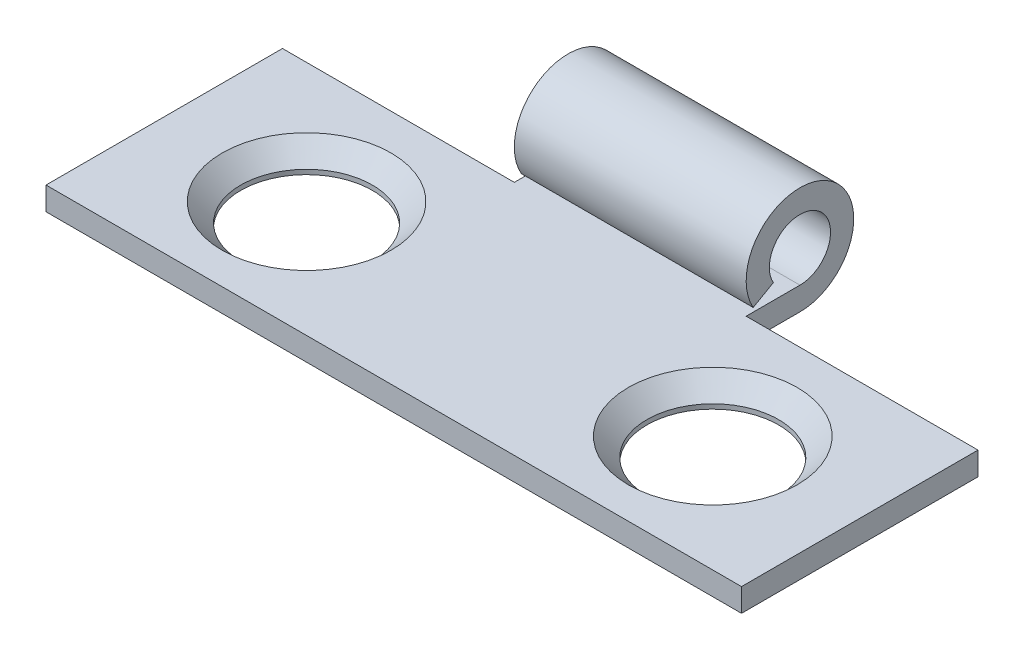
ISO-10303-21;
HEADER;
FILE_DESCRIPTION(('STEP AP214'),'2;1');
FILE_NAME('part.step','',(''),(''),'','','');
FILE_SCHEMA(('AUTOMOTIVE_DESIGN { 1 0 10303 214 1 1 1 1 }'));
ENDSEC;
DATA;
#1=APPLICATION_CONTEXT('core data for automotive mechanical design processes');
#2=APPLICATION_PROTOCOL_DEFINITION('international standard','automotive_design',2000,#1);
#3=PRODUCT_CONTEXT('',#1,'mechanical');
#4=PRODUCT('Part','Part','',(#3));
#5=PRODUCT_RELATED_PRODUCT_CATEGORY('part','',(#4));
#6=PRODUCT_DEFINITION_FORMATION('','',#4);
#7=PRODUCT_DEFINITION_CONTEXT('part definition',#1,'design');
#8=PRODUCT_DEFINITION('design','',#6,#7);
#9=PRODUCT_DEFINITION_SHAPE('','',#8);
#10=(LENGTH_UNIT() NAMED_UNIT(*) SI_UNIT(.MILLI.,.METRE.));
#11=(NAMED_UNIT(*) PLANE_ANGLE_UNIT() SI_UNIT($,.RADIAN.));
#12=(NAMED_UNIT(*) SI_UNIT($,.STERADIAN.) SOLID_ANGLE_UNIT());
#13=UNCERTAINTY_MEASURE_WITH_UNIT(LENGTH_MEASURE(1.E-05),#10,'distance_accuracy_value','');
#14=(GEOMETRIC_REPRESENTATION_CONTEXT(3) GLOBAL_UNCERTAINTY_ASSIGNED_CONTEXT((#13)) GLOBAL_UNIT_ASSIGNED_CONTEXT((#10,
#11,#12)) REPRESENTATION_CONTEXT('',''));
#15=CARTESIAN_POINT('',(0.,0.,0.));
#16=DIRECTION('',(0.,0.,1.));
#17=DIRECTION('',(1.,0.,0.));
#18=AXIS2_PLACEMENT_3D('',#15,#16,#17);
#19=CARTESIAN_POINT('',(9.525,0.,0.));
#20=DIRECTION('',(-1.,0.,0.));
#21=DIRECTION('',(0.,0.,1.));
#22=AXIS2_PLACEMENT_3D('',#19,#20,#21);
#23=CYLINDRICAL_SURFACE('',#22,1.47320000000008);
#24=CARTESIAN_POINT('',(-3.175,0.,0.));
#25=DIRECTION('',(1.,0.,0.));
#26=DIRECTION('',(0.,0.,-1.));
#27=AXIS2_PLACEMENT_3D('',#24,#25,#26);
#28=CIRCLE('',#27,1.47320000000008);
#29=CARTESIAN_POINT('',(-3.175,-1.4732,0.));
#30=VERTEX_POINT('',#29);
#31=CARTESIAN_POINT('',(-3.175,-0.728533124002553,1.28045215733782));
#32=VERTEX_POINT('',#31);
#33=EDGE_CURVE('E134',#30,#32,#28,.T.);
#34=ORIENTED_EDGE('',*,*,#33,.T.);
#35=DIRECTION('',(-1.,0.,0.));
#36=VECTOR('',#35,1.);
#37=CARTESIAN_POINT('',(9.525,-0.728533124002553,1.28045215733782));
#38=LINE('',#37,#36);
#39=CARTESIAN_POINT('',(3.175,-0.728533124002552,1.28045215733782));
#40=VERTEX_POINT('',#39);
#41=EDGE_CURVE('E192',#40,#32,#38,.T.);
#42=ORIENTED_EDGE('',*,*,#41,.F.);
#43=CARTESIAN_POINT('',(3.175,0.,0.));
#44=DIRECTION('',(-1.,0.,0.));
#45=DIRECTION('',(0.,0.,1.));
#46=AXIS2_PLACEMENT_3D('',#43,#44,#45);
#47=CIRCLE('',#46,1.47320000000008);
#48=CARTESIAN_POINT('',(3.175,-1.4732,0.));
#49=VERTEX_POINT('',#48);
#50=EDGE_CURVE('E164',#40,#49,#47,.T.);
#51=ORIENTED_EDGE('',*,*,#50,.T.);
#52=DIRECTION('',(-1.,0.,0.));
#53=VECTOR('',#52,1.);
#54=CARTESIAN_POINT('',(9.525,-1.4732,0.));
#55=LINE('',#54,#53);
#56=EDGE_CURVE('E195',#49,#30,#55,.T.);
#57=ORIENTED_EDGE('',*,*,#56,.T.);
#58=EDGE_LOOP('',(#34,#42,#51,#57));
#59=FACE_BOUND('',#58,.T.);
#60=ADVANCED_FACE('F43',(#59),#23,.T.);
#61=CARTESIAN_POINT('',(9.525,0.,0.));
#62=DIRECTION('',(-1.,0.,0.));
#63=DIRECTION('',(0.,0.,1.));
#64=AXIS2_PLACEMENT_3D('',#61,#62,#63);
#65=CYLINDRICAL_SURFACE('',#64,0.8382);
#66=DIRECTION('',(-1.,0.,0.));
#67=VECTOR('',#66,1.);
#68=CARTESIAN_POINT('',(9.525,-0.414510225725591,0.728533124002553));
#69=LINE('',#68,#67);
#70=CARTESIAN_POINT('',(3.175,-0.414510225725591,0.728533124002553));
#71=VERTEX_POINT('',#70);
#72=CARTESIAN_POINT('',(-3.175,-0.414510225725591,0.728533124002553));
#73=VERTEX_POINT('',#72);
#74=EDGE_CURVE('E185',#71,#73,#69,.T.);
#75=ORIENTED_EDGE('',*,*,#74,.T.);
#76=CARTESIAN_POINT('',(-3.175,0.,0.));
#77=DIRECTION('',(1.,0.,0.));
#78=DIRECTION('',(0.,0.,-1.));
#79=AXIS2_PLACEMENT_3D('',#76,#77,#78);
#80=CIRCLE('',#79,0.8382);
#81=CARTESIAN_POINT('',(-3.175,-0.8382,0.));
#82=VERTEX_POINT('',#81);
#83=EDGE_CURVE('E171',#73,#82,#80,.F.);
#84=ORIENTED_EDGE('',*,*,#83,.T.);
#85=DIRECTION('',(-1.,0.,0.));
#86=VECTOR('',#85,1.);
#87=CARTESIAN_POINT('',(9.525,-0.8382,0.));
#88=LINE('',#87,#86);
#89=CARTESIAN_POINT('',(3.175,-0.8382,0.));
#90=VERTEX_POINT('',#89);
#91=EDGE_CURVE('E202',#90,#82,#88,.T.);
#92=ORIENTED_EDGE('',*,*,#91,.F.);
#93=CARTESIAN_POINT('',(3.175,0.,0.));
#94=DIRECTION('',(-1.,0.,0.));
#95=DIRECTION('',(0.,0.,1.));
#96=AXIS2_PLACEMENT_3D('',#93,#94,#95);
#97=CIRCLE('',#96,0.8382);
#98=EDGE_CURVE('E163',#90,#71,#97,.F.);
#99=ORIENTED_EDGE('',*,*,#98,.T.);
#100=EDGE_LOOP('',(#75,#84,#92,#99));
#101=FACE_BOUND('',#100,.T.);
#102=ADVANCED_FACE('F45',(#101),#65,.F.);
#103=CARTESIAN_POINT('',(9.525,-0.8382,7.9502));
#104=DIRECTION('',(0.,-1.,0.));
#105=DIRECTION('',(0.,0.,-1.));
#106=AXIS2_PLACEMENT_3D('',#103,#104,#105);
#107=PLANE('',#106);
#108=CARTESIAN_POINT('',(5.5626,-0.8382,4.7752));
#109=DIRECTION('',(0.,1.,0.));
#110=DIRECTION('',(0.,0.,1.));
#111=AXIS2_PLACEMENT_3D('',#108,#109,#110);
#112=CIRCLE('',#111,2.3114);
#113=CARTESIAN_POINT('',(5.5626,-0.8382,7.0866));
#114=VERTEX_POINT('',#113);
#115=EDGE_CURVE('E157',#114,#114,#112,.T.);
#116=ORIENTED_EDGE('',*,*,#115,.F.);
#117=EDGE_LOOP('',(#116));
#118=FACE_BOUND('',#117,.T.);
#119=CARTESIAN_POINT('',(-5.5626,-0.8382,4.7752));
#120=DIRECTION('',(0.,1.,0.));
#121=DIRECTION('',(0.,0.,1.));
#122=AXIS2_PLACEMENT_3D('',#119,#120,#121);
#123=CIRCLE('',#122,2.3114);
#124=CARTESIAN_POINT('',(-5.5626,-0.8382,7.0866));
#125=VERTEX_POINT('',#124);
#126=EDGE_CURVE('E149',#125,#125,#123,.T.);
#127=ORIENTED_EDGE('',*,*,#126,.F.);
#128=EDGE_LOOP('',(#127));
#129=FACE_BOUND('',#128,.T.);
#130=ORIENTED_EDGE('',*,*,#91,.T.);
#131=DIRECTION('',(0.,0.,1.));
#132=VECTOR('',#131,1.);
#133=CARTESIAN_POINT('',(-3.175,-0.8382,7.9502));
#134=LINE('',#133,#132);
#135=CARTESIAN_POINT('',(-3.175,-0.8382,1.47320000000012));
#136=VERTEX_POINT('',#135);
#137=EDGE_CURVE('E173',#82,#136,#134,.T.);
#138=ORIENTED_EDGE('',*,*,#137,.T.);
#139=DIRECTION('',(-1.,0.,0.));
#140=VECTOR('',#139,1.);
#141=CARTESIAN_POINT('',(9.5250000000001,-0.8382,1.47320000000031));
#142=LINE('',#141,#140);
#143=CARTESIAN_POINT('',(-9.52499999999999,-0.8382,1.47320000000003));
#144=VERTEX_POINT('',#143);
#145=EDGE_CURVE('E125',#136,#144,#142,.T.);
#146=ORIENTED_EDGE('',*,*,#145,.T.);
#147=DIRECTION('',(0.,0.,1.));
#148=VECTOR('',#147,1.);
#149=CARTESIAN_POINT('',(-9.525,-0.8382,7.9502));
#150=LINE('',#149,#148);
#151=CARTESIAN_POINT('',(-9.525,-0.8382,7.9502));
#152=VERTEX_POINT('',#151);
#153=EDGE_CURVE('E177',#144,#152,#150,.T.);
#154=ORIENTED_EDGE('',*,*,#153,.T.);
#155=DIRECTION('',(-1.,0.,0.));
#156=VECTOR('',#155,1.);
#157=CARTESIAN_POINT('',(9.525,-0.8382,7.9502));
#158=LINE('',#157,#156);
#159=CARTESIAN_POINT('',(9.525,-0.8382,7.9502));
#160=VERTEX_POINT('',#159);
#161=EDGE_CURVE('E199',#160,#152,#158,.T.);
#162=ORIENTED_EDGE('',*,*,#161,.F.);
#163=DIRECTION('',(0.,0.,1.));
#164=VECTOR('',#163,1.);
#165=CARTESIAN_POINT('',(9.525,-0.8382,7.9502));
#166=LINE('',#165,#164);
#167=CARTESIAN_POINT('',(9.525,-0.8382,1.47320000000003));
#168=VERTEX_POINT('',#167);
#169=EDGE_CURVE('E178',#168,#160,#166,.T.);
#170=ORIENTED_EDGE('',*,*,#169,.F.);
#171=DIRECTION('',(-1.,0.,0.));
#172=VECTOR('',#171,1.);
#173=CARTESIAN_POINT('',(9.52499999999991,-0.8382,1.47320000000003));
#174=LINE('',#173,#172);
#175=CARTESIAN_POINT('',(3.175,-0.8382,1.47320000000012));
#176=VERTEX_POINT('',#175);
#177=EDGE_CURVE('E60',#168,#176,#174,.T.);
#178=ORIENTED_EDGE('',*,*,#177,.T.);
#179=DIRECTION('',(0.,0.,-1.));
#180=VECTOR('',#179,1.);
#181=CARTESIAN_POINT('',(3.175,-0.8382,7.9502));
#182=LINE('',#181,#180);
#183=EDGE_CURVE('E166',#176,#90,#182,.T.);
#184=ORIENTED_EDGE('',*,*,#183,.T.);
#185=EDGE_LOOP('',(#130,#138,#146,#154,#162,#170,#178,#184));
#186=FACE_BOUND('',#185,.T.);
#187=ADVANCED_FACE('F227',(#118,#129,#186),#107,.F.);
#188=CARTESIAN_POINT('',(9.525,-1.4732,7.9502));
#189=DIRECTION('',(0.,0.,-1.));
#190=DIRECTION('',(-1.,0.,0.));
#191=AXIS2_PLACEMENT_3D('',#188,#189,#190);
#192=PLANE('',#191);
#193=DIRECTION('',(0.,-1.,0.));
#194=VECTOR('',#193,1.);
#195=CARTESIAN_POINT('',(-9.525,-1.4732,7.9502));
#196=LINE('',#195,#194);
#197=CARTESIAN_POINT('',(-9.525,-1.4732,7.9502));
#198=VERTEX_POINT('',#197);
#199=EDGE_CURVE('E187',#152,#198,#196,.T.);
#200=ORIENTED_EDGE('',*,*,#199,.T.);
#201=DIRECTION('',(-1.,0.,0.));
#202=VECTOR('',#201,1.);
#203=CARTESIAN_POINT('',(9.525,-1.4732,7.9502));
#204=LINE('',#203,#202);
#205=CARTESIAN_POINT('',(9.525,-1.4732,7.9502));
#206=VERTEX_POINT('',#205);
#207=EDGE_CURVE('E197',#206,#198,#204,.T.);
#208=ORIENTED_EDGE('',*,*,#207,.F.);
#209=DIRECTION('',(0.,-1.,0.));
#210=VECTOR('',#209,1.);
#211=CARTESIAN_POINT('',(9.525,-1.4732,7.9502));
#212=LINE('',#211,#210);
#213=EDGE_CURVE('E180',#160,#206,#212,.T.);
#214=ORIENTED_EDGE('',*,*,#213,.F.);
#215=ORIENTED_EDGE('',*,*,#161,.T.);
#216=EDGE_LOOP('',(#200,#208,#214,#215));
#217=FACE_BOUND('',#216,.T.);
#218=ADVANCED_FACE('F230',(#217),#192,.F.);
#219=CARTESIAN_POINT('',(9.525,-1.4732,0.));
#220=DIRECTION('',(0.,1.,0.));
#221=DIRECTION('',(0.,0.,1.));
#222=AXIS2_PLACEMENT_3D('',#219,#220,#221);
#223=PLANE('',#222);
#224=CARTESIAN_POINT('',(5.5626,-1.4732,4.7752));
#225=DIRECTION('',(0.,1.,0.));
#226=DIRECTION('',(0.,0.,1.));
#227=AXIS2_PLACEMENT_3D('',#224,#225,#226);
#228=CIRCLE('',#227,1.8034);
#229=CARTESIAN_POINT('',(5.5626,-1.4732,6.5786));
#230=VERTEX_POINT('',#229);
#231=EDGE_CURVE('E208',#230,#230,#228,.T.);
#232=ORIENTED_EDGE('',*,*,#231,.T.);
#233=EDGE_LOOP('',(#232));
#234=FACE_BOUND('',#233,.T.);
#235=CARTESIAN_POINT('',(-5.5626,-1.4732,4.7752));
#236=DIRECTION('',(0.,1.,0.));
#237=DIRECTION('',(0.,0.,1.));
#238=AXIS2_PLACEMENT_3D('',#235,#236,#237);
#239=CIRCLE('',#238,1.8034);
#240=CARTESIAN_POINT('',(-5.5626,-1.4732,6.5786));
#241=VERTEX_POINT('',#240);
#242=EDGE_CURVE('E213',#241,#241,#239,.T.);
#243=ORIENTED_EDGE('',*,*,#242,.T.);
#244=EDGE_LOOP('',(#243));
#245=FACE_BOUND('',#244,.T.);
#246=DIRECTION('',(1.,0.,0.));
#247=VECTOR('',#246,1.);
#248=CARTESIAN_POINT('',(0.,-1.4732,1.47320000000017));
#249=LINE('',#248,#247);
#250=CARTESIAN_POINT('',(-9.525,-1.4732,1.47320000000012));
#251=VERTEX_POINT('',#250);
#252=CARTESIAN_POINT('',(-3.175,-1.4732,1.47320000000012));
#253=VERTEX_POINT('',#252);
#254=EDGE_CURVE('E68',#251,#253,#249,.T.);
#255=ORIENTED_EDGE('',*,*,#254,.T.);
#256=DIRECTION('',(0.,0.,-1.));
#257=VECTOR('',#256,1.);
#258=CARTESIAN_POINT('',(-3.175,-1.4732,0.));
#259=LINE('',#258,#257);
#260=EDGE_CURVE('E131',#253,#30,#259,.T.);
#261=ORIENTED_EDGE('',*,*,#260,.T.);
#262=ORIENTED_EDGE('',*,*,#56,.F.);
#263=DIRECTION('',(0.,0.,1.));
#264=VECTOR('',#263,1.);
#265=CARTESIAN_POINT('',(3.175,-1.4732,0.));
#266=LINE('',#265,#264);
#267=CARTESIAN_POINT('',(3.175,-1.4732,1.47320000000012));
#268=VERTEX_POINT('',#267);
#269=EDGE_CURVE('E153',#49,#268,#266,.T.);
#270=ORIENTED_EDGE('',*,*,#269,.T.);
#271=DIRECTION('',(1.,0.,0.));
#272=VECTOR('',#271,1.);
#273=CARTESIAN_POINT('',(0.,-1.4732,1.47320000000017));
#274=LINE('',#273,#272);
#275=CARTESIAN_POINT('',(9.525,-1.4732,1.47320000000003));
#276=VERTEX_POINT('',#275);
#277=EDGE_CURVE('E156',#268,#276,#274,.T.);
#278=ORIENTED_EDGE('',*,*,#277,.T.);
#279=DIRECTION('',(0.,0.,-1.));
#280=VECTOR('',#279,1.);
#281=CARTESIAN_POINT('',(9.525,-1.4732,0.));
#282=LINE('',#281,#280);
#283=EDGE_CURVE('E182',#206,#276,#282,.T.);
#284=ORIENTED_EDGE('',*,*,#283,.F.);
#285=ORIENTED_EDGE('',*,*,#207,.T.);
#286=DIRECTION('',(0.,0.,-1.));
#287=VECTOR('',#286,1.);
#288=CARTESIAN_POINT('',(-9.525,-1.4732,0.));
#289=LINE('',#288,#287);
#290=EDGE_CURVE('E143',#198,#251,#289,.T.);
#291=ORIENTED_EDGE('',*,*,#290,.T.);
#292=EDGE_LOOP('',(#255,#261,#262,#270,#278,#284,#285,#291));
#293=FACE_BOUND('',#292,.T.);
#294=ADVANCED_FACE('F140',(#234,#245,#293),#223,.F.);
#295=CARTESIAN_POINT('',(9.525,-0.414510225725591,0.728533124002553));
#296=DIRECTION('',(0.,0.869163832024043,0.49452424925506));
#297=DIRECTION('',(0.,-0.49452424925506,0.869163832024043));
#298=AXIS2_PLACEMENT_3D('',#295,#296,#297);
#299=PLANE('',#298);
#300=ORIENTED_EDGE('',*,*,#41,.T.);
#301=DIRECTION('',(0.,0.49452424925506,-0.869163832024043));
#302=VECTOR('',#301,1.);
#303=CARTESIAN_POINT('',(-3.175,-0.414510225725592,0.728533124002554));
#304=LINE('',#303,#302);
#305=EDGE_CURVE('E11',#32,#73,#304,.T.);
#306=ORIENTED_EDGE('',*,*,#305,.T.);
#307=ORIENTED_EDGE('',*,*,#74,.F.);
#308=DIRECTION('',(0.,-0.49452424925506,0.869163832024043));
#309=VECTOR('',#308,1.);
#310=CARTESIAN_POINT('',(3.175,-0.414510225725591,0.728533124002554));
#311=LINE('',#310,#309);
#312=EDGE_CURVE('E52',#71,#40,#311,.T.);
#313=ORIENTED_EDGE('',*,*,#312,.T.);
#314=EDGE_LOOP('',(#300,#306,#307,#313));
#315=FACE_BOUND('',#314,.T.);
#316=ADVANCED_FACE('F236',(#315),#299,.F.);
#317=CARTESIAN_POINT('',(9.525,0.,0.));
#318=DIRECTION('',(-1.,0.,0.));
#319=DIRECTION('',(0.,0.,1.));
#320=AXIS2_PLACEMENT_3D('',#317,#318,#319);
#321=PLANE('',#320);
#322=ORIENTED_EDGE('',*,*,#283,.T.);
#323=DIRECTION('',(0.,1.,0.));
#324=VECTOR('',#323,1.);
#325=CARTESIAN_POINT('',(9.525,-1.4732,1.47320000000003));
#326=LINE('',#325,#324);
#327=EDGE_CURVE('E144',#276,#168,#326,.T.);
#328=ORIENTED_EDGE('',*,*,#327,.T.);
#329=ORIENTED_EDGE('',*,*,#169,.T.);
#330=ORIENTED_EDGE('',*,*,#213,.T.);
#331=EDGE_LOOP('',(#322,#328,#329,#330));
#332=FACE_BOUND('',#331,.T.);
#333=ADVANCED_FACE('F247',(#332),#321,.F.);
#334=CARTESIAN_POINT('',(-9.525,0.,0.));
#335=DIRECTION('',(-1.,0.,0.));
#336=DIRECTION('',(0.,0.,1.));
#337=AXIS2_PLACEMENT_3D('',#334,#335,#336);
#338=PLANE('',#337);
#339=DIRECTION('',(0.,1.,0.));
#340=VECTOR('',#339,1.);
#341=CARTESIAN_POINT('',(-9.52499999999999,-1.4732,1.47320000000003));
#342=LINE('',#341,#340);
#343=EDGE_CURVE('E128',#251,#144,#342,.T.);
#344=ORIENTED_EDGE('',*,*,#343,.F.);
#345=ORIENTED_EDGE('',*,*,#290,.F.);
#346=ORIENTED_EDGE('',*,*,#199,.F.);
#347=ORIENTED_EDGE('',*,*,#153,.F.);
#348=EDGE_LOOP('',(#344,#345,#346,#347));
#349=FACE_BOUND('',#348,.T.);
#350=ADVANCED_FACE('F255',(#349),#338,.T.);
#351=CARTESIAN_POINT('',(-3.175,-1.4732,0.));
#352=DIRECTION('',(1.,0.,0.));
#353=DIRECTION('',(0.,0.,-1.));
#354=AXIS2_PLACEMENT_3D('',#351,#352,#353);
#355=PLANE('',#354);
#356=ORIENTED_EDGE('',*,*,#83,.F.);
#357=ORIENTED_EDGE('',*,*,#305,.F.);
#358=ORIENTED_EDGE('',*,*,#33,.F.);
#359=ORIENTED_EDGE('',*,*,#260,.F.);
#360=DIRECTION('',(0.,1.,0.));
#361=VECTOR('',#360,1.);
#362=CARTESIAN_POINT('',(-3.175,-1.4732,1.47320000000012));
#363=LINE('',#362,#361);
#364=EDGE_CURVE('E121',#253,#136,#363,.T.);
#365=ORIENTED_EDGE('',*,*,#364,.T.);
#366=ORIENTED_EDGE('',*,*,#137,.F.);
#367=EDGE_LOOP('',(#356,#357,#358,#359,#365,#366));
#368=FACE_BOUND('',#367,.T.);
#369=ADVANCED_FACE('F132',(#368),#355,.F.);
#370=CARTESIAN_POINT('',(0.,-1.4732,1.47320000000017));
#371=DIRECTION('',(0.,0.,1.));
#372=DIRECTION('',(1.,0.,0.));
#373=AXIS2_PLACEMENT_3D('',#370,#371,#372);
#374=PLANE('',#373);
#375=ORIENTED_EDGE('',*,*,#364,.F.);
#376=ORIENTED_EDGE('',*,*,#254,.F.);
#377=ORIENTED_EDGE('',*,*,#343,.T.);
#378=ORIENTED_EDGE('',*,*,#145,.F.);
#379=EDGE_LOOP('',(#375,#376,#377,#378));
#380=FACE_BOUND('',#379,.T.);
#381=ADVANCED_FACE('F123',(#380),#374,.F.);
#382=CARTESIAN_POINT('',(3.175,-1.4732,0.));
#383=DIRECTION('',(-1.,0.,0.));
#384=DIRECTION('',(0.,0.,1.));
#385=AXIS2_PLACEMENT_3D('',#382,#383,#384);
#386=PLANE('',#385);
#387=ORIENTED_EDGE('',*,*,#50,.F.);
#388=ORIENTED_EDGE('',*,*,#312,.F.);
#389=ORIENTED_EDGE('',*,*,#98,.F.);
#390=ORIENTED_EDGE('',*,*,#183,.F.);
#391=DIRECTION('',(0.,1.,0.));
#392=VECTOR('',#391,1.);
#393=CARTESIAN_POINT('',(3.175,-1.4732,1.47320000000012));
#394=LINE('',#393,#392);
#395=EDGE_CURVE('E146',#268,#176,#394,.T.);
#396=ORIENTED_EDGE('',*,*,#395,.F.);
#397=ORIENTED_EDGE('',*,*,#269,.F.);
#398=EDGE_LOOP('',(#387,#388,#389,#390,#396,#397));
#399=FACE_BOUND('',#398,.T.);
#400=ADVANCED_FACE('F243',(#399),#386,.F.);
#401=CARTESIAN_POINT('',(0.,-1.4732,1.47320000000017));
#402=DIRECTION('',(0.,0.,1.));
#403=DIRECTION('',(1.,0.,0.));
#404=AXIS2_PLACEMENT_3D('',#401,#402,#403);
#405=PLANE('',#404);
#406=ORIENTED_EDGE('',*,*,#327,.F.);
#407=ORIENTED_EDGE('',*,*,#277,.F.);
#408=ORIENTED_EDGE('',*,*,#395,.T.);
#409=ORIENTED_EDGE('',*,*,#177,.F.);
#410=EDGE_LOOP('',(#406,#407,#408,#409));
#411=FACE_BOUND('',#410,.T.);
#412=ADVANCED_FACE('F244',(#411),#405,.F.);
#413=CARTESIAN_POINT('',(-5.5626,-0.8382,4.7752));
#414=DIRECTION('',(0.,1.,0.));
#415=DIRECTION('',(0.,0.,1.));
#416=AXIS2_PLACEMENT_3D('',#413,#414,#415);
#417=CONICAL_SURFACE('',#416,2.3114,0.78539816339745);
#418=CARTESIAN_POINT('',(-5.5626,-1.3462,4.7752));
#419=DIRECTION('',(0.,1.,0.));
#420=DIRECTION('',(0.,0.,1.));
#421=AXIS2_PLACEMENT_3D('',#418,#419,#420);
#422=CIRCLE('',#421,1.8034);
#423=CARTESIAN_POINT('',(-5.5626,-1.3462,6.5786));
#424=VERTEX_POINT('',#423);
#425=EDGE_CURVE('E47',#424,#424,#422,.F.);
#426=ORIENTED_EDGE('',*,*,#425,.T.);
#427=EDGE_LOOP('',(#426));
#428=FACE_BOUND('',#427,.T.);
#429=ORIENTED_EDGE('',*,*,#126,.T.);
#430=EDGE_LOOP('',(#429));
#431=FACE_BOUND('',#430,.T.);
#432=ADVANCED_FACE('F225',(#428,#431),#417,.F.);
#433=CARTESIAN_POINT('',(5.5626,-0.8382,4.7752));
#434=DIRECTION('',(0.,1.,0.));
#435=DIRECTION('',(0.,0.,1.));
#436=AXIS2_PLACEMENT_3D('',#433,#434,#435);
#437=CONICAL_SURFACE('',#436,2.3114,0.78539816339745);
#438=CARTESIAN_POINT('',(5.5626,-1.3462,4.7752));
#439=DIRECTION('',(0.,1.,0.));
#440=DIRECTION('',(0.,0.,1.));
#441=AXIS2_PLACEMENT_3D('',#438,#439,#440);
#442=CIRCLE('',#441,1.8034);
#443=CARTESIAN_POINT('',(5.5626,-1.3462,6.5786));
#444=VERTEX_POINT('',#443);
#445=EDGE_CURVE('E206',#444,#444,#442,.F.);
#446=ORIENTED_EDGE('',*,*,#445,.T.);
#447=EDGE_LOOP('',(#446));
#448=FACE_BOUND('',#447,.T.);
#449=ORIENTED_EDGE('',*,*,#115,.T.);
#450=EDGE_LOOP('',(#449));
#451=FACE_BOUND('',#450,.T.);
#452=ADVANCED_FACE('F382',(#448,#451),#437,.F.);
#453=CARTESIAN_POINT('',(5.5626,-1.4732,4.7752));
#454=DIRECTION('',(0.,1.,0.));
#455=DIRECTION('',(0.,0.,1.));
#456=AXIS2_PLACEMENT_3D('',#453,#454,#455);
#457=CYLINDRICAL_SURFACE('',#456,1.8034);
#458=ORIENTED_EDGE('',*,*,#231,.F.);
#459=EDGE_LOOP('',(#458));
#460=FACE_BOUND('',#459,.T.);
#461=ORIENTED_EDGE('',*,*,#445,.F.);
#462=EDGE_LOOP('',(#461));
#463=FACE_BOUND('',#462,.T.);
#464=ADVANCED_FACE('F391',(#460,#463),#457,.F.);
#465=CARTESIAN_POINT('',(-5.5626,-1.4732,4.7752));
#466=DIRECTION('',(0.,1.,0.));
#467=DIRECTION('',(0.,0.,1.));
#468=AXIS2_PLACEMENT_3D('',#465,#466,#467);
#469=CYLINDRICAL_SURFACE('',#468,1.8034);
#470=ORIENTED_EDGE('',*,*,#242,.F.);
#471=EDGE_LOOP('',(#470));
#472=FACE_BOUND('',#471,.T.);
#473=ORIENTED_EDGE('',*,*,#425,.F.);
#474=EDGE_LOOP('',(#473));
#475=FACE_BOUND('',#474,.T.);
#476=ADVANCED_FACE('F400',(#472,#475),#469,.F.);
#477=CLOSED_SHELL('',(#60,#102,#187,#218,#294,#316,#333,#350,#369,#381,#400,#412,#432,#452,#464,#476));
#478=MANIFOLD_SOLID_BREP('B2',#477);
#479=ADVANCED_BREP_SHAPE_REPRESENTATION('',(#18,#478),#14);
#480=SHAPE_DEFINITION_REPRESENTATION(#9,#479);
ENDSEC;
END-ISO-10303-21;
